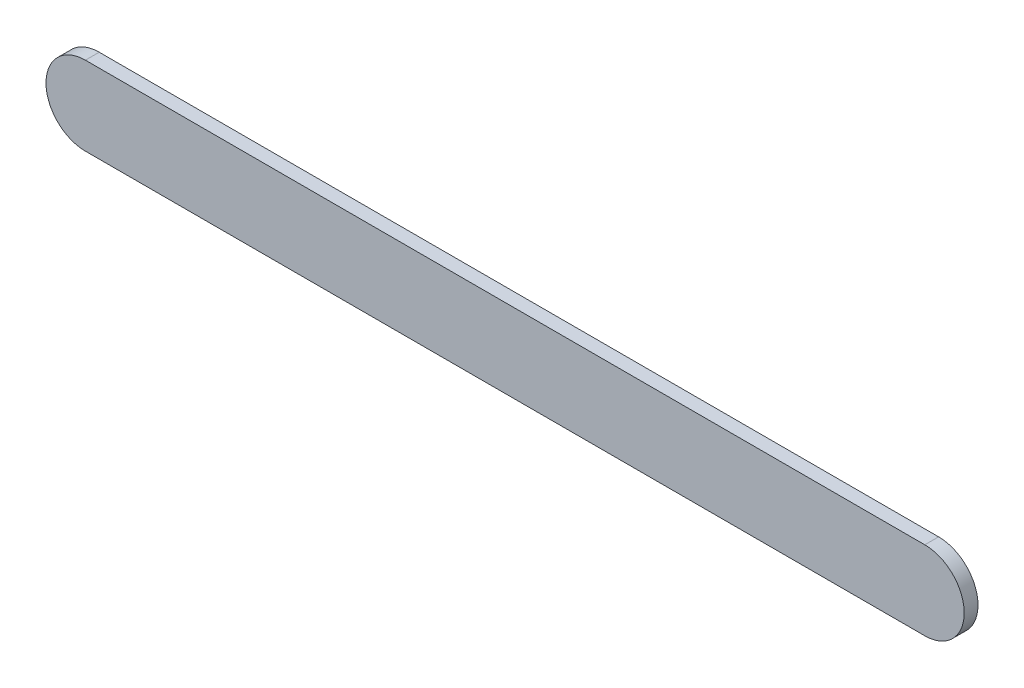
ISO-10303-21;
HEADER;
FILE_DESCRIPTION(('STEP AP214'),'2;1');
FILE_NAME('part.step','',(''),(''),'','','');
FILE_SCHEMA(('AUTOMOTIVE_DESIGN { 1 0 10303 214 1 1 1 1 }'));
ENDSEC;
DATA;
#1=APPLICATION_CONTEXT('core data for automotive mechanical design processes');
#2=APPLICATION_PROTOCOL_DEFINITION('international standard','automotive_design',2000,#1);
#3=PRODUCT_CONTEXT('',#1,'mechanical');
#4=PRODUCT('Part','Part','',(#3));
#5=PRODUCT_RELATED_PRODUCT_CATEGORY('part','',(#4));
#6=PRODUCT_DEFINITION_FORMATION('','',#4);
#7=PRODUCT_DEFINITION_CONTEXT('part definition',#1,'design');
#8=PRODUCT_DEFINITION('design','',#6,#7);
#9=PRODUCT_DEFINITION_SHAPE('','',#8);
#10=(LENGTH_UNIT() NAMED_UNIT(*) SI_UNIT(.MILLI.,.METRE.));
#11=(NAMED_UNIT(*) PLANE_ANGLE_UNIT() SI_UNIT($,.RADIAN.));
#12=(NAMED_UNIT(*) SI_UNIT($,.STERADIAN.) SOLID_ANGLE_UNIT());
#13=UNCERTAINTY_MEASURE_WITH_UNIT(LENGTH_MEASURE(1.E-05),#10,'distance_accuracy_value','');
#14=(GEOMETRIC_REPRESENTATION_CONTEXT(3) GLOBAL_UNCERTAINTY_ASSIGNED_CONTEXT((#13)) GLOBAL_UNIT_ASSIGNED_CONTEXT((#10,
#11,#12)) REPRESENTATION_CONTEXT('',''));
#15=CARTESIAN_POINT('',(0.,0.,0.));
#16=DIRECTION('',(0.,0.,1.));
#17=DIRECTION('',(1.,0.,0.));
#18=AXIS2_PLACEMENT_3D('',#15,#16,#17);
#19=CARTESIAN_POINT('',(87.7,-132.7,1.635));
#20=DIRECTION('',(0.,0.,1.));
#21=DIRECTION('',(1.,0.,0.));
#22=AXIS2_PLACEMENT_3D('',#19,#20,#21);
#23=PLANE('',#22);
#24=DIRECTION('',(1.,0.,0.));
#25=VECTOR('',#24,1.);
#26=CARTESIAN_POINT('',(87.7,-132.7,1.635));
#27=LINE('',#26,#25);
#28=CARTESIAN_POINT('',(87.7,-132.7,1.635));
#29=VERTEX_POINT('',#28);
#30=CARTESIAN_POINT('',(89.829925,-132.7,1.635));
#31=VERTEX_POINT('',#30);
#32=EDGE_CURVE('E91',#29,#31,#27,.T.);
#33=ORIENTED_EDGE('',*,*,#32,.T.);
#34=CARTESIAN_POINT('',(89.829925,-132.6,1.635));
#35=DIRECTION('',(0.,0.,1.));
#36=DIRECTION('',(-1.42108547152E-13,-1.,0.));
#37=AXIS2_PLACEMENT_3D('',#34,#35,#36);
#38=CIRCLE('',#37,0.09999999999999);
#39=CARTESIAN_POINT('',(89.829925,-132.5,1.635));
#40=VERTEX_POINT('',#39);
#41=EDGE_CURVE('E72',#31,#40,#38,.T.);
#42=ORIENTED_EDGE('',*,*,#41,.T.);
#43=DIRECTION('',(-1.,0.,0.));
#44=VECTOR('',#43,1.);
#45=CARTESIAN_POINT('',(89.829925,-132.5,1.635));
#46=LINE('',#45,#44);
#47=CARTESIAN_POINT('',(87.7,-132.5,1.635));
#48=VERTEX_POINT('',#47);
#49=EDGE_CURVE('E85',#40,#48,#46,.T.);
#50=ORIENTED_EDGE('',*,*,#49,.T.);
#51=CARTESIAN_POINT('',(87.7,-132.6,1.635));
#52=DIRECTION('',(0.,0.,1.));
#53=DIRECTION('',(1.42108547152E-13,1.,0.));
#54=AXIS2_PLACEMENT_3D('',#51,#52,#53);
#55=CIRCLE('',#54,0.09999999999999);
#56=EDGE_CURVE('E11',#48,#29,#55,.T.);
#57=ORIENTED_EDGE('',*,*,#56,.T.);
#58=EDGE_LOOP('',(#33,#42,#50,#57));
#59=FACE_BOUND('',#58,.T.);
#60=ADVANCED_FACE('F17',(#59),#23,.T.);
#61=CARTESIAN_POINT('',(87.7,-132.7,1.6));
#62=DIRECTION('',(0.,0.,1.));
#63=DIRECTION('',(1.,0.,0.));
#64=AXIS2_PLACEMENT_3D('',#61,#62,#63);
#65=PLANE('',#64);
#66=CARTESIAN_POINT('',(87.7,-132.6,1.6));
#67=DIRECTION('',(0.,0.,1.));
#68=DIRECTION('',(1.42108547152E-13,1.,0.));
#69=AXIS2_PLACEMENT_3D('',#66,#67,#68);
#70=CIRCLE('',#69,0.09999999999999);
#71=CARTESIAN_POINT('',(87.7,-132.5,1.6));
#72=VERTEX_POINT('',#71);
#73=CARTESIAN_POINT('',(87.7,-132.7,1.6));
#74=VERTEX_POINT('',#73);
#75=EDGE_CURVE('E25',#72,#74,#70,.T.);
#76=ORIENTED_EDGE('',*,*,#75,.F.);
#77=DIRECTION('',(-1.,0.,0.));
#78=VECTOR('',#77,1.);
#79=CARTESIAN_POINT('',(89.829925,-132.5,1.6));
#80=LINE('',#79,#78);
#81=CARTESIAN_POINT('',(89.829925,-132.5,1.6));
#82=VERTEX_POINT('',#81);
#83=EDGE_CURVE('E57',#82,#72,#80,.T.);
#84=ORIENTED_EDGE('',*,*,#83,.F.);
#85=CARTESIAN_POINT('',(89.829925,-132.6,1.6));
#86=DIRECTION('',(0.,0.,1.));
#87=DIRECTION('',(-1.42108547152E-13,-1.,0.));
#88=AXIS2_PLACEMENT_3D('',#85,#86,#87);
#89=CIRCLE('',#88,0.09999999999999);
#90=CARTESIAN_POINT('',(89.829925,-132.7,1.6));
#91=VERTEX_POINT('',#90);
#92=EDGE_CURVE('E93',#91,#82,#89,.T.);
#93=ORIENTED_EDGE('',*,*,#92,.F.);
#94=DIRECTION('',(1.,0.,0.));
#95=VECTOR('',#94,1.);
#96=CARTESIAN_POINT('',(87.7,-132.7,1.6));
#97=LINE('',#96,#95);
#98=EDGE_CURVE('E90',#74,#91,#97,.T.);
#99=ORIENTED_EDGE('',*,*,#98,.F.);
#100=EDGE_LOOP('',(#76,#84,#93,#99));
#101=FACE_BOUND('',#100,.T.);
#102=ADVANCED_FACE('F95',(#101),#65,.F.);
#103=CARTESIAN_POINT('',(87.7,-132.6,1.6));
#104=DIRECTION('',(0.,0.,-1.));
#105=DIRECTION('',(1.42108547152E-13,1.,0.));
#106=AXIS2_PLACEMENT_3D('',#103,#104,#105);
#107=CYLINDRICAL_SURFACE('',#106,0.09999999999999);
#108=ORIENTED_EDGE('',*,*,#75,.T.);
#109=DIRECTION('',(0.,0.,1.));
#110=VECTOR('',#109,1.);
#111=CARTESIAN_POINT('',(87.7,-132.7,1.6));
#112=LINE('',#111,#110);
#113=EDGE_CURVE('E80',#74,#29,#112,.T.);
#114=ORIENTED_EDGE('',*,*,#113,.T.);
#115=ORIENTED_EDGE('',*,*,#56,.F.);
#116=DIRECTION('',(0.,0.,1.));
#117=VECTOR('',#116,1.);
#118=CARTESIAN_POINT('',(87.7,-132.5,1.6));
#119=LINE('',#118,#117);
#120=EDGE_CURVE('E83',#72,#48,#119,.T.);
#121=ORIENTED_EDGE('',*,*,#120,.F.);
#122=EDGE_LOOP('',(#108,#114,#115,#121));
#123=FACE_BOUND('',#122,.T.);
#124=ADVANCED_FACE('F79',(#123),#107,.T.);
#125=CARTESIAN_POINT('',(89.829925,-132.5,1.6));
#126=DIRECTION('',(0.,-1.,0.));
#127=DIRECTION('',(0.,0.,-1.));
#128=AXIS2_PLACEMENT_3D('',#125,#126,#127);
#129=PLANE('',#128);
#130=ORIENTED_EDGE('',*,*,#83,.T.);
#131=ORIENTED_EDGE('',*,*,#120,.T.);
#132=ORIENTED_EDGE('',*,*,#49,.F.);
#133=DIRECTION('',(0.,0.,1.));
#134=VECTOR('',#133,1.);
#135=CARTESIAN_POINT('',(89.829925,-132.5,1.6));
#136=LINE('',#135,#134);
#137=EDGE_CURVE('E110',#82,#40,#136,.T.);
#138=ORIENTED_EDGE('',*,*,#137,.F.);
#139=EDGE_LOOP('',(#130,#131,#132,#138));
#140=FACE_BOUND('',#139,.T.);
#141=ADVANCED_FACE('F123',(#140),#129,.F.);
#142=CARTESIAN_POINT('',(89.829925,-132.6,1.6));
#143=DIRECTION('',(0.,0.,-1.));
#144=DIRECTION('',(-1.42108547152E-13,-1.,0.));
#145=AXIS2_PLACEMENT_3D('',#142,#143,#144);
#146=CYLINDRICAL_SURFACE('',#145,0.09999999999999);
#147=ORIENTED_EDGE('',*,*,#92,.T.);
#148=ORIENTED_EDGE('',*,*,#137,.T.);
#149=ORIENTED_EDGE('',*,*,#41,.F.);
#150=DIRECTION('',(0.,0.,1.));
#151=VECTOR('',#150,1.);
#152=CARTESIAN_POINT('',(89.829925,-132.7,1.6));
#153=LINE('',#152,#151);
#154=EDGE_CURVE('E98',#91,#31,#153,.T.);
#155=ORIENTED_EDGE('',*,*,#154,.F.);
#156=EDGE_LOOP('',(#147,#148,#149,#155));
#157=FACE_BOUND('',#156,.T.);
#158=ADVANCED_FACE('F124',(#157),#146,.T.);
#159=CARTESIAN_POINT('',(87.7,-132.7,1.6));
#160=DIRECTION('',(0.,1.,0.));
#161=DIRECTION('',(1.,0.,0.));
#162=AXIS2_PLACEMENT_3D('',#159,#160,#161);
#163=PLANE('',#162);
#164=ORIENTED_EDGE('',*,*,#98,.T.);
#165=ORIENTED_EDGE('',*,*,#154,.T.);
#166=ORIENTED_EDGE('',*,*,#32,.F.);
#167=ORIENTED_EDGE('',*,*,#113,.F.);
#168=EDGE_LOOP('',(#164,#165,#166,#167));
#169=FACE_BOUND('',#168,.T.);
#170=ADVANCED_FACE('F88',(#169),#163,.F.);
#171=CLOSED_SHELL('',(#60,#102,#124,#141,#158,#170));
#172=MANIFOLD_SOLID_BREP('B1',#171);
#173=ADVANCED_BREP_SHAPE_REPRESENTATION('',(#18,#172),#14);
#174=SHAPE_DEFINITION_REPRESENTATION(#9,#173);
ENDSEC;
END-ISO-10303-21;
